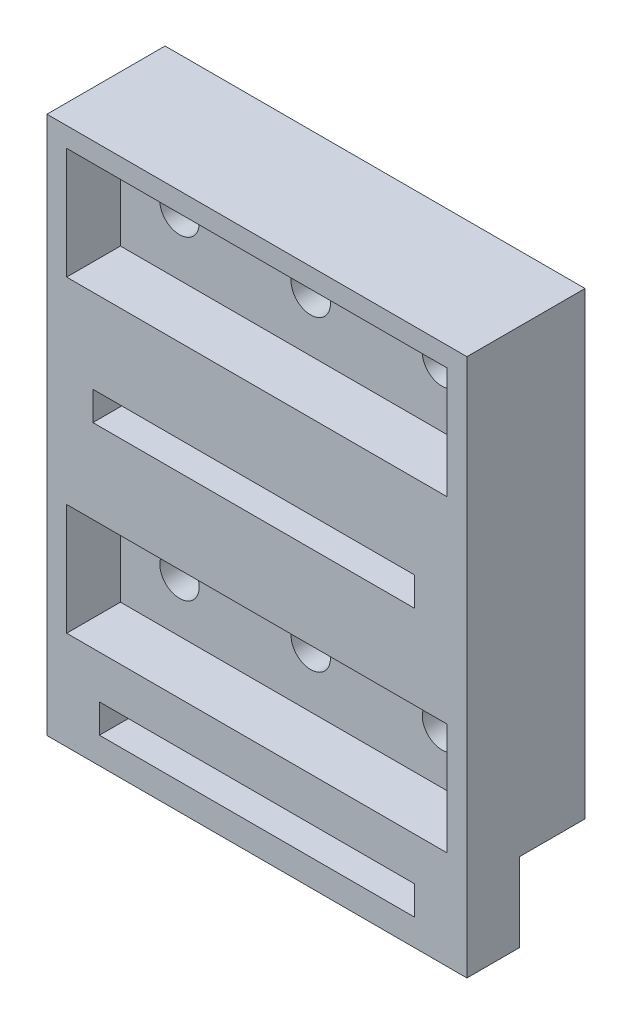
ISO-10303-21;
HEADER;
FILE_DESCRIPTION(('STEP AP214'),'2;1');
FILE_NAME('part.step','',(''),(''),'','','');
FILE_SCHEMA(('AUTOMOTIVE_DESIGN { 1 0 10303 214 1 1 1 1 }'));
ENDSEC;
DATA;
#1=APPLICATION_CONTEXT('core data for automotive mechanical design processes');
#2=APPLICATION_PROTOCOL_DEFINITION('international standard','automotive_design',2000,#1);
#3=PRODUCT_CONTEXT('',#1,'mechanical');
#4=PRODUCT('Part','Part','',(#3));
#5=PRODUCT_RELATED_PRODUCT_CATEGORY('part','',(#4));
#6=PRODUCT_DEFINITION_FORMATION('','',#4);
#7=PRODUCT_DEFINITION_CONTEXT('part definition',#1,'design');
#8=PRODUCT_DEFINITION('design','',#6,#7);
#9=PRODUCT_DEFINITION_SHAPE('','',#8);
#10=(LENGTH_UNIT() NAMED_UNIT(*) SI_UNIT(.MILLI.,.METRE.));
#11=(NAMED_UNIT(*) PLANE_ANGLE_UNIT() SI_UNIT($,.RADIAN.));
#12=(NAMED_UNIT(*) SI_UNIT($,.STERADIAN.) SOLID_ANGLE_UNIT());
#13=UNCERTAINTY_MEASURE_WITH_UNIT(LENGTH_MEASURE(1.E-05),#10,'distance_accuracy_value','');
#14=(GEOMETRIC_REPRESENTATION_CONTEXT(3) GLOBAL_UNCERTAINTY_ASSIGNED_CONTEXT((#13)) GLOBAL_UNIT_ASSIGNED_CONTEXT((#10,
#11,#12)) REPRESENTATION_CONTEXT('',''));
#15=CARTESIAN_POINT('',(0.,0.,0.));
#16=DIRECTION('',(0.,0.,1.));
#17=DIRECTION('',(1.,0.,0.));
#18=AXIS2_PLACEMENT_3D('',#15,#16,#17);
#19=CARTESIAN_POINT('',(-16.,-17.5,9.));
#20=DIRECTION('',(0.,1.,0.));
#21=DIRECTION('',(0.,0.,1.));
#22=AXIS2_PLACEMENT_3D('',#19,#20,#21);
#23=PLANE('',#22);
#24=DIRECTION('',(1.,0.,0.));
#25=VECTOR('',#24,1.);
#26=CARTESIAN_POINT('',(16.,-17.5,5.));
#27=LINE('',#26,#25);
#28=CARTESIAN_POINT('',(-16.,-17.5,5.));
#29=VERTEX_POINT('',#28);
#30=CARTESIAN_POINT('',(16.,-17.5,5.));
#31=VERTEX_POINT('',#30);
#32=EDGE_CURVE('E237',#29,#31,#27,.T.);
#33=ORIENTED_EDGE('',*,*,#32,.F.);
#34=DIRECTION('',(0.,0.,-1.));
#35=VECTOR('',#34,1.);
#36=CARTESIAN_POINT('',(-16.,-17.5,9.));
#37=LINE('',#36,#35);
#38=CARTESIAN_POINT('',(-16.,-17.5,0.));
#39=VERTEX_POINT('',#38);
#40=EDGE_CURVE('E420',#29,#39,#37,.T.);
#41=ORIENTED_EDGE('',*,*,#40,.T.);
#42=DIRECTION('',(1.,0.,0.));
#43=VECTOR('',#42,1.);
#44=CARTESIAN_POINT('',(-16.,-17.5,0.));
#45=LINE('',#44,#43);
#46=CARTESIAN_POINT('',(16.,-17.5,0.));
#47=VERTEX_POINT('',#46);
#48=EDGE_CURVE('E407',#39,#47,#45,.T.);
#49=ORIENTED_EDGE('',*,*,#48,.T.);
#50=DIRECTION('',(0.,0.,-1.));
#51=VECTOR('',#50,1.);
#52=CARTESIAN_POINT('',(16.,-17.5,9.));
#53=LINE('',#52,#51);
#54=EDGE_CURVE('E418',#31,#47,#53,.T.);
#55=ORIENTED_EDGE('',*,*,#54,.F.);
#56=EDGE_LOOP('',(#33,#41,#49,#55));
#57=FACE_BOUND('',#56,.T.);
#58=ADVANCED_FACE('F38',(#57),#23,.F.);
#59=CARTESIAN_POINT('',(-14.5,17.5,9.));
#60=DIRECTION('',(1.,0.,0.));
#61=DIRECTION('',(0.,1.,0.));
#62=AXIS2_PLACEMENT_3D('',#59,#60,#61);
#63=PLANE('',#62);
#64=DIRECTION('',(0.,-1.,0.));
#65=VECTOR('',#64,1.);
#66=CARTESIAN_POINT('',(-14.5,17.5,9.));
#67=LINE('',#66,#65);
#68=CARTESIAN_POINT('',(-14.5,16.,9.));
#69=VERTEX_POINT('',#68);
#70=CARTESIAN_POINT('',(-14.5,7.5,9.));
#71=VERTEX_POINT('',#70);
#72=EDGE_CURVE('E389',#69,#71,#67,.T.);
#73=ORIENTED_EDGE('',*,*,#72,.T.);
#74=DIRECTION('',(0.,0.,1.));
#75=VECTOR('',#74,1.);
#76=CARTESIAN_POINT('',(-14.5,7.5,9.));
#77=LINE('',#76,#75);
#78=CARTESIAN_POINT('',(-14.5,7.5,4.9));
#79=VERTEX_POINT('',#78);
#80=EDGE_CURVE('E304',#71,#79,#77,.F.);
#81=ORIENTED_EDGE('',*,*,#80,.T.);
#82=DIRECTION('',(0.,-1.,0.));
#83=VECTOR('',#82,1.);
#84=CARTESIAN_POINT('',(-14.5,17.5,4.9));
#85=LINE('',#84,#83);
#86=CARTESIAN_POINT('',(-14.5,16.,4.9));
#87=VERTEX_POINT('',#86);
#88=EDGE_CURVE('E363',#87,#79,#85,.T.);
#89=ORIENTED_EDGE('',*,*,#88,.F.);
#90=DIRECTION('',(0.,0.,-1.));
#91=VECTOR('',#90,1.);
#92=CARTESIAN_POINT('',(-14.5,16.,9.));
#93=LINE('',#92,#91);
#94=EDGE_CURVE('E372',#69,#87,#93,.T.);
#95=ORIENTED_EDGE('',*,*,#94,.F.);
#96=EDGE_LOOP('',(#73,#81,#89,#95));
#97=FACE_BOUND('',#96,.T.);
#98=ADVANCED_FACE('F458',(#97),#63,.T.);
#99=CARTESIAN_POINT('',(14.5,17.5,9.));
#100=DIRECTION('',(-1.,0.,0.));
#101=DIRECTION('',(0.,-1.,0.));
#102=AXIS2_PLACEMENT_3D('',#99,#100,#101);
#103=PLANE('',#102);
#104=DIRECTION('',(0.,1.,0.));
#105=VECTOR('',#104,1.);
#106=CARTESIAN_POINT('',(14.5,17.5,4.9));
#107=LINE('',#106,#105);
#108=CARTESIAN_POINT('',(14.5,7.5,4.9));
#109=VERTEX_POINT('',#108);
#110=CARTESIAN_POINT('',(14.5,16.,4.9));
#111=VERTEX_POINT('',#110);
#112=EDGE_CURVE('E378',#109,#111,#107,.T.);
#113=ORIENTED_EDGE('',*,*,#112,.F.);
#114=DIRECTION('',(0.,0.,1.));
#115=VECTOR('',#114,1.);
#116=CARTESIAN_POINT('',(14.5,7.5,9.));
#117=LINE('',#116,#115);
#118=CARTESIAN_POINT('',(14.5,7.5,9.));
#119=VERTEX_POINT('',#118);
#120=EDGE_CURVE('E321',#119,#109,#117,.F.);
#121=ORIENTED_EDGE('',*,*,#120,.F.);
#122=DIRECTION('',(0.,1.,0.));
#123=VECTOR('',#122,1.);
#124=CARTESIAN_POINT('',(14.5,17.5,9.));
#125=LINE('',#124,#123);
#126=CARTESIAN_POINT('',(14.5,16.,9.));
#127=VERTEX_POINT('',#126);
#128=EDGE_CURVE('E393',#119,#127,#125,.T.);
#129=ORIENTED_EDGE('',*,*,#128,.T.);
#130=DIRECTION('',(0.,0.,-1.));
#131=VECTOR('',#130,1.);
#132=CARTESIAN_POINT('',(14.5,16.,9.));
#133=LINE('',#132,#131);
#134=EDGE_CURVE('E375',#127,#111,#133,.T.);
#135=ORIENTED_EDGE('',*,*,#134,.T.);
#136=EDGE_LOOP('',(#113,#121,#129,#135));
#137=FACE_BOUND('',#136,.T.);
#138=ADVANCED_FACE('F463',(#137),#103,.T.);
#139=CARTESIAN_POINT('',(0.,0.,4.9));
#140=DIRECTION('',(0.,0.,1.));
#141=DIRECTION('',(1.,0.,0.));
#142=AXIS2_PLACEMENT_3D('',#139,#140,#141);
#143=PLANE('',#142);
#144=CARTESIAN_POINT('',(10.,12.,4.9));
#145=DIRECTION('',(0.,0.,1.));
#146=DIRECTION('',(-1.,0.,0.));
#147=AXIS2_PLACEMENT_3D('',#144,#145,#146);
#148=CIRCLE('',#147,1.5);
#149=CARTESIAN_POINT('',(8.5,12.,4.9));
#150=VERTEX_POINT('',#149);
#151=EDGE_CURVE('E320',#150,#150,#148,.T.);
#152=ORIENTED_EDGE('',*,*,#151,.F.);
#153=EDGE_LOOP('',(#152));
#154=FACE_BOUND('',#153,.T.);
#155=CARTESIAN_POINT('',(0.,11.7,4.9));
#156=DIRECTION('',(0.,0.,1.));
#157=DIRECTION('',(1.,0.,0.));
#158=AXIS2_PLACEMENT_3D('',#155,#156,#157);
#159=CIRCLE('',#158,1.5);
#160=CARTESIAN_POINT('',(1.5,11.7,4.9));
#161=VERTEX_POINT('',#160);
#162=EDGE_CURVE('E333',#161,#161,#159,.T.);
#163=ORIENTED_EDGE('',*,*,#162,.F.);
#164=EDGE_LOOP('',(#163));
#165=FACE_BOUND('',#164,.T.);
#166=CARTESIAN_POINT('',(-10.,12.,4.9));
#167=DIRECTION('',(0.,0.,1.));
#168=DIRECTION('',(-1.,0.,0.));
#169=AXIS2_PLACEMENT_3D('',#166,#167,#168);
#170=CIRCLE('',#169,1.5);
#171=CARTESIAN_POINT('',(-11.5,12.,4.9));
#172=VERTEX_POINT('',#171);
#173=EDGE_CURVE('E329',#172,#172,#170,.T.);
#174=ORIENTED_EDGE('',*,*,#173,.F.);
#175=EDGE_LOOP('',(#174));
#176=FACE_BOUND('',#175,.T.);
#177=ORIENTED_EDGE('',*,*,#88,.T.);
#178=DIRECTION('',(1.,0.,0.));
#179=VECTOR('',#178,1.);
#180=CARTESIAN_POINT('',(0.,7.5,4.9));
#181=LINE('',#180,#179);
#182=EDGE_CURVE('E422',#79,#109,#181,.T.);
#183=ORIENTED_EDGE('',*,*,#182,.T.);
#184=ORIENTED_EDGE('',*,*,#112,.T.);
#185=DIRECTION('',(-1.,0.,0.));
#186=VECTOR('',#185,1.);
#187=CARTESIAN_POINT('',(-16.,16.,4.9));
#188=LINE('',#187,#186);
#189=EDGE_CURVE('E384',#111,#87,#188,.T.);
#190=ORIENTED_EDGE('',*,*,#189,.T.);
#191=EDGE_LOOP('',(#177,#183,#184,#190));
#192=FACE_BOUND('',#191,.T.);
#193=ADVANCED_FACE('F488',(#154,#165,#176,#192),#143,.T.);
#194=CARTESIAN_POINT('',(-16.,17.5,9.));
#195=DIRECTION('',(1.,0.,0.));
#196=DIRECTION('',(0.,1.,0.));
#197=AXIS2_PLACEMENT_3D('',#194,#195,#196);
#198=PLANE('',#197);
#199=ORIENTED_EDGE('',*,*,#40,.F.);
#200=DIRECTION('',(0.,1.,0.));
#201=VECTOR('',#200,1.);
#202=CARTESIAN_POINT('',(-16.,-23.5,4.99999999999999));
#203=LINE('',#202,#201);
#204=CARTESIAN_POINT('',(-16.,-23.5,4.99999999999999));
#205=VERTEX_POINT('',#204);
#206=EDGE_CURVE('E255',#205,#29,#203,.T.);
#207=ORIENTED_EDGE('',*,*,#206,.F.);
#208=DIRECTION('',(0.,0.,-1.));
#209=VECTOR('',#208,1.);
#210=CARTESIAN_POINT('',(-16.,-23.5,9.));
#211=LINE('',#210,#209);
#212=CARTESIAN_POINT('',(-16.,-23.5,9.));
#213=VERTEX_POINT('',#212);
#214=EDGE_CURVE('E246',#213,#205,#211,.T.);
#215=ORIENTED_EDGE('',*,*,#214,.F.);
#216=DIRECTION('',(0.,-1.,0.));
#217=VECTOR('',#216,1.);
#218=CARTESIAN_POINT('',(-16.,17.5,9.));
#219=LINE('',#218,#217);
#220=CARTESIAN_POINT('',(-16.,17.5,9.));
#221=VERTEX_POINT('',#220);
#222=EDGE_CURVE('E397',#221,#213,#219,.T.);
#223=ORIENTED_EDGE('',*,*,#222,.F.);
#224=DIRECTION('',(0.,0.,-1.));
#225=VECTOR('',#224,1.);
#226=CARTESIAN_POINT('',(-16.,17.5,9.));
#227=LINE('',#226,#225);
#228=CARTESIAN_POINT('',(-16.,17.5,0.));
#229=VERTEX_POINT('',#228);
#230=EDGE_CURVE('E404',#221,#229,#227,.T.);
#231=ORIENTED_EDGE('',*,*,#230,.T.);
#232=DIRECTION('',(0.,-1.,0.));
#233=VECTOR('',#232,1.);
#234=CARTESIAN_POINT('',(-16.,17.5,0.));
#235=LINE('',#234,#233);
#236=EDGE_CURVE('E370',#229,#39,#235,.T.);
#237=ORIENTED_EDGE('',*,*,#236,.T.);
#238=EDGE_LOOP('',(#199,#207,#215,#223,#231,#237));
#239=FACE_BOUND('',#238,.T.);
#240=ADVANCED_FACE('F40',(#239),#198,.F.);
#241=CARTESIAN_POINT('',(16.,17.5,9.));
#242=DIRECTION('',(-1.,0.,0.));
#243=DIRECTION('',(0.,-1.,0.));
#244=AXIS2_PLACEMENT_3D('',#241,#242,#243);
#245=PLANE('',#244);
#246=DIRECTION('',(0.,0.,-1.));
#247=VECTOR('',#246,1.);
#248=CARTESIAN_POINT('',(16.,17.5,9.));
#249=LINE('',#248,#247);
#250=CARTESIAN_POINT('',(16.,17.5,9.));
#251=VERTEX_POINT('',#250);
#252=CARTESIAN_POINT('',(16.,17.5,0.));
#253=VERTEX_POINT('',#252);
#254=EDGE_CURVE('E415',#251,#253,#249,.T.);
#255=ORIENTED_EDGE('',*,*,#254,.F.);
#256=DIRECTION('',(0.,1.,0.));
#257=VECTOR('',#256,1.);
#258=CARTESIAN_POINT('',(16.,17.5,9.));
#259=LINE('',#258,#257);
#260=CARTESIAN_POINT('',(16.,-23.5,9.));
#261=VERTEX_POINT('',#260);
#262=EDGE_CURVE('E399',#261,#251,#259,.T.);
#263=ORIENTED_EDGE('',*,*,#262,.F.);
#264=DIRECTION('',(0.,0.,1.));
#265=VECTOR('',#264,1.);
#266=CARTESIAN_POINT('',(16.,-23.5,9.));
#267=LINE('',#266,#265);
#268=CARTESIAN_POINT('',(16.,-23.5,5.));
#269=VERTEX_POINT('',#268);
#270=EDGE_CURVE('E240',#269,#261,#267,.T.);
#271=ORIENTED_EDGE('',*,*,#270,.F.);
#272=DIRECTION('',(0.,1.,0.));
#273=VECTOR('',#272,1.);
#274=CARTESIAN_POINT('',(16.,-23.5,5.));
#275=LINE('',#274,#273);
#276=EDGE_CURVE('E250',#269,#31,#275,.T.);
#277=ORIENTED_EDGE('',*,*,#276,.T.);
#278=ORIENTED_EDGE('',*,*,#54,.T.);
#279=DIRECTION('',(0.,1.,0.));
#280=VECTOR('',#279,1.);
#281=CARTESIAN_POINT('',(16.,17.5,0.));
#282=LINE('',#281,#280);
#283=EDGE_CURVE('E410',#47,#253,#282,.T.);
#284=ORIENTED_EDGE('',*,*,#283,.T.);
#285=EDGE_LOOP('',(#255,#263,#271,#277,#278,#284));
#286=FACE_BOUND('',#285,.T.);
#287=ADVANCED_FACE('F468',(#286),#245,.F.);
#288=CARTESIAN_POINT('',(-16.,17.5,9.));
#289=DIRECTION('',(0.,-1.,0.));
#290=DIRECTION('',(0.,0.,-1.));
#291=AXIS2_PLACEMENT_3D('',#288,#289,#290);
#292=PLANE('',#291);
#293=DIRECTION('',(-1.,0.,0.));
#294=VECTOR('',#293,1.);
#295=CARTESIAN_POINT('',(-16.,17.5,0.));
#296=LINE('',#295,#294);
#297=EDGE_CURVE('E400',#253,#229,#296,.T.);
#298=ORIENTED_EDGE('',*,*,#297,.T.);
#299=ORIENTED_EDGE('',*,*,#230,.F.);
#300=DIRECTION('',(-1.,0.,0.));
#301=VECTOR('',#300,1.);
#302=CARTESIAN_POINT('',(-16.,17.5,9.));
#303=LINE('',#302,#301);
#304=EDGE_CURVE('E402',#251,#221,#303,.T.);
#305=ORIENTED_EDGE('',*,*,#304,.F.);
#306=ORIENTED_EDGE('',*,*,#254,.T.);
#307=EDGE_LOOP('',(#298,#299,#305,#306));
#308=FACE_BOUND('',#307,.T.);
#309=ADVANCED_FACE('F471',(#308),#292,.F.);
#310=CARTESIAN_POINT('',(0.,0.,9.));
#311=DIRECTION('',(0.,0.,1.));
#312=DIRECTION('',(1.,0.,0.));
#313=AXIS2_PLACEMENT_3D('',#310,#311,#312);
#314=PLANE('',#313);
#315=DIRECTION('',(0.,1.,0.));
#316=VECTOR('',#315,1.);
#317=CARTESIAN_POINT('',(12.,-21.48,9.));
#318=LINE('',#317,#316);
#319=CARTESIAN_POINT('',(12.,-21.48,9.));
#320=VERTEX_POINT('',#319);
#321=CARTESIAN_POINT('',(12.,-19.28,9.));
#322=VERTEX_POINT('',#321);
#323=EDGE_CURVE('E53',#320,#322,#318,.T.);
#324=ORIENTED_EDGE('',*,*,#323,.F.);
#325=DIRECTION('',(1.,0.,0.));
#326=VECTOR('',#325,1.);
#327=CARTESIAN_POINT('',(12.,-21.48,9.));
#328=LINE('',#327,#326);
#329=CARTESIAN_POINT('',(-12.,-21.48,9.));
#330=VERTEX_POINT('',#329);
#331=EDGE_CURVE('E230',#330,#320,#328,.T.);
#332=ORIENTED_EDGE('',*,*,#331,.F.);
#333=DIRECTION('',(0.,-1.,0.));
#334=VECTOR('',#333,1.);
#335=CARTESIAN_POINT('',(-12.,-21.48,9.));
#336=LINE('',#335,#334);
#337=CARTESIAN_POINT('',(-12.,-19.28,9.));
#338=VERTEX_POINT('',#337);
#339=EDGE_CURVE('E214',#338,#330,#336,.T.);
#340=ORIENTED_EDGE('',*,*,#339,.F.);
#341=DIRECTION('',(-1.,0.,0.));
#342=VECTOR('',#341,1.);
#343=CARTESIAN_POINT('',(12.,-19.28,9.));
#344=LINE('',#343,#342);
#345=EDGE_CURVE('E223',#322,#338,#344,.T.);
#346=ORIENTED_EDGE('',*,*,#345,.F.);
#347=EDGE_LOOP('',(#324,#332,#340,#346));
#348=FACE_BOUND('',#347,.T.);
#349=DIRECTION('',(0.,-1.,0.));
#350=VECTOR('',#349,1.);
#351=CARTESIAN_POINT('',(-12.5,0.,9.));
#352=LINE('',#351,#350);
#353=CARTESIAN_POINT('',(-12.5,1.1,9.));
#354=VERTEX_POINT('',#353);
#355=CARTESIAN_POINT('',(-12.5,-1.1,9.));
#356=VERTEX_POINT('',#355);
#357=EDGE_CURVE('E434',#354,#356,#352,.T.);
#358=ORIENTED_EDGE('',*,*,#357,.F.);
#359=DIRECTION('',(-1.,0.,0.));
#360=VECTOR('',#359,1.);
#361=CARTESIAN_POINT('',(0.,1.1,9.));
#362=LINE('',#361,#360);
#363=CARTESIAN_POINT('',(12.,1.1,9.));
#364=VERTEX_POINT('',#363);
#365=EDGE_CURVE('E426',#364,#354,#362,.T.);
#366=ORIENTED_EDGE('',*,*,#365,.F.);
#367=DIRECTION('',(0.,1.,0.));
#368=VECTOR('',#367,1.);
#369=CARTESIAN_POINT('',(12.,0.,9.));
#370=LINE('',#369,#368);
#371=CARTESIAN_POINT('',(12.,-1.1,9.));
#372=VERTEX_POINT('',#371);
#373=EDGE_CURVE('E429',#372,#364,#370,.T.);
#374=ORIENTED_EDGE('',*,*,#373,.F.);
#375=DIRECTION('',(1.,0.,0.));
#376=VECTOR('',#375,1.);
#377=CARTESIAN_POINT('',(0.,-1.1,9.));
#378=LINE('',#377,#376);
#379=EDGE_CURVE('E432',#356,#372,#378,.T.);
#380=ORIENTED_EDGE('',*,*,#379,.F.);
#381=EDGE_LOOP('',(#358,#366,#374,#380));
#382=FACE_BOUND('',#381,.T.);
#383=CARTESIAN_POINT('',(-14.5,-7.5,9.));
#384=VERTEX_POINT('',#383);
#385=CARTESIAN_POINT('',(-14.5,-16.,9.));
#386=VERTEX_POINT('',#385);
#387=EDGE_CURVE('E388',#384,#386,#67,.T.);
#388=ORIENTED_EDGE('',*,*,#387,.F.);
#389=DIRECTION('',(1.,0.,0.));
#390=VECTOR('',#389,1.);
#391=CARTESIAN_POINT('',(14.5,-7.5,9.));
#392=LINE('',#391,#390);
#393=CARTESIAN_POINT('',(14.5,-7.5,9.));
#394=VERTEX_POINT('',#393);
#395=EDGE_CURVE('E313',#394,#384,#392,.F.);
#396=ORIENTED_EDGE('',*,*,#395,.F.);
#397=CARTESIAN_POINT('',(14.5,-16.,9.));
#398=VERTEX_POINT('',#397);
#399=EDGE_CURVE('E394',#398,#394,#125,.T.);
#400=ORIENTED_EDGE('',*,*,#399,.F.);
#401=DIRECTION('',(1.,0.,0.));
#402=VECTOR('',#401,1.);
#403=CARTESIAN_POINT('',(-16.,-16.,9.));
#404=LINE('',#403,#402);
#405=EDGE_CURVE('E391',#386,#398,#404,.T.);
#406=ORIENTED_EDGE('',*,*,#405,.F.);
#407=EDGE_LOOP('',(#388,#396,#400,#406));
#408=FACE_BOUND('',#407,.T.);
#409=DIRECTION('',(1.,0.,0.));
#410=VECTOR('',#409,1.);
#411=CARTESIAN_POINT('',(14.5,7.5,9.));
#412=LINE('',#411,#410);
#413=EDGE_CURVE('E317',#119,#71,#412,.F.);
#414=ORIENTED_EDGE('',*,*,#413,.T.);
#415=ORIENTED_EDGE('',*,*,#72,.F.);
#416=DIRECTION('',(-1.,0.,0.));
#417=VECTOR('',#416,1.);
#418=CARTESIAN_POINT('',(-16.,16.,9.));
#419=LINE('',#418,#417);
#420=EDGE_CURVE('E376',#127,#69,#419,.T.);
#421=ORIENTED_EDGE('',*,*,#420,.F.);
#422=ORIENTED_EDGE('',*,*,#128,.F.);
#423=EDGE_LOOP('',(#414,#415,#421,#422));
#424=FACE_BOUND('',#423,.T.);
#425=ORIENTED_EDGE('',*,*,#262,.T.);
#426=ORIENTED_EDGE('',*,*,#304,.T.);
#427=ORIENTED_EDGE('',*,*,#222,.T.);
#428=DIRECTION('',(-1.,0.,0.));
#429=VECTOR('',#428,1.);
#430=CARTESIAN_POINT('',(16.,-23.5,9.));
#431=LINE('',#430,#429);
#432=EDGE_CURVE('E243',#261,#213,#431,.T.);
#433=ORIENTED_EDGE('',*,*,#432,.F.);
#434=EDGE_LOOP('',(#425,#426,#427,#433));
#435=FACE_BOUND('',#434,.T.);
#436=ADVANCED_FACE('F227',(#348,#382,#408,#424,#435),#314,.T.);
#437=CARTESIAN_POINT('',(0.,0.,0.));
#438=DIRECTION('',(0.,0.,1.));
#439=DIRECTION('',(1.,0.,0.));
#440=AXIS2_PLACEMENT_3D('',#437,#438,#439);
#441=PLANE('',#440);
#442=DIRECTION('',(1.,0.,0.));
#443=VECTOR('',#442,1.);
#444=CARTESIAN_POINT('',(-14.,5.,0.));
#445=LINE('',#444,#443);
#446=CARTESIAN_POINT('',(-14.,5.,0.));
#447=VERTEX_POINT('',#446);
#448=CARTESIAN_POINT('',(14.,5.,0.));
#449=VERTEX_POINT('',#448);
#450=EDGE_CURVE('E294',#447,#449,#445,.T.);
#451=ORIENTED_EDGE('',*,*,#450,.F.);
#452=DIRECTION('',(0.,1.,0.));
#453=VECTOR('',#452,1.);
#454=CARTESIAN_POINT('',(-14.,-5.,0.));
#455=LINE('',#454,#453);
#456=CARTESIAN_POINT('',(-14.,-5.,0.));
#457=VERTEX_POINT('',#456);
#458=EDGE_CURVE('E272',#457,#447,#455,.T.);
#459=ORIENTED_EDGE('',*,*,#458,.F.);
#460=DIRECTION('',(-1.,0.,0.));
#461=VECTOR('',#460,1.);
#462=CARTESIAN_POINT('',(-14.,-5.,0.));
#463=LINE('',#462,#461);
#464=CARTESIAN_POINT('',(14.,-5.,0.));
#465=VERTEX_POINT('',#464);
#466=EDGE_CURVE('E283',#465,#457,#463,.T.);
#467=ORIENTED_EDGE('',*,*,#466,.F.);
#468=DIRECTION('',(0.,-1.,0.));
#469=VECTOR('',#468,1.);
#470=CARTESIAN_POINT('',(14.,-5.,0.));
#471=LINE('',#470,#469);
#472=EDGE_CURVE('E297',#449,#465,#471,.T.);
#473=ORIENTED_EDGE('',*,*,#472,.F.);
#474=EDGE_LOOP('',(#451,#459,#467,#473));
#475=FACE_BOUND('',#474,.T.);
#476=ORIENTED_EDGE('',*,*,#297,.F.);
#477=ORIENTED_EDGE('',*,*,#283,.F.);
#478=ORIENTED_EDGE('',*,*,#48,.F.);
#479=ORIENTED_EDGE('',*,*,#236,.F.);
#480=EDGE_LOOP('',(#476,#477,#478,#479));
#481=FACE_BOUND('',#480,.T.);
#482=CARTESIAN_POINT('',(-10.,12.,0.));
#483=DIRECTION('',(0.,0.,1.));
#484=DIRECTION('',(1.,0.,0.));
#485=AXIS2_PLACEMENT_3D('',#482,#483,#484);
#486=CIRCLE('',#485,1.5);
#487=CARTESIAN_POINT('',(-8.5,12.,0.));
#488=VERTEX_POINT('',#487);
#489=EDGE_CURVE('E359',#488,#488,#486,.T.);
#490=ORIENTED_EDGE('',*,*,#489,.T.);
#491=EDGE_LOOP('',(#490));
#492=FACE_BOUND('',#491,.T.);
#493=CARTESIAN_POINT('',(0.,11.7,0.));
#494=DIRECTION('',(0.,0.,1.));
#495=DIRECTION('',(1.,0.,0.));
#496=AXIS2_PLACEMENT_3D('',#493,#494,#495);
#497=CIRCLE('',#496,1.5);
#498=CARTESIAN_POINT('',(1.5,11.7,0.));
#499=VERTEX_POINT('',#498);
#500=EDGE_CURVE('E353',#499,#499,#497,.T.);
#501=ORIENTED_EDGE('',*,*,#500,.T.);
#502=EDGE_LOOP('',(#501));
#503=FACE_BOUND('',#502,.T.);
#504=CARTESIAN_POINT('',(10.,12.,0.));
#505=DIRECTION('',(0.,0.,1.));
#506=DIRECTION('',(1.,0.,0.));
#507=AXIS2_PLACEMENT_3D('',#504,#505,#506);
#508=CIRCLE('',#507,1.5);
#509=CARTESIAN_POINT('',(11.5,12.,0.));
#510=VERTEX_POINT('',#509);
#511=EDGE_CURVE('E347',#510,#510,#508,.T.);
#512=ORIENTED_EDGE('',*,*,#511,.T.);
#513=EDGE_LOOP('',(#512));
#514=FACE_BOUND('',#513,.T.);
#515=CARTESIAN_POINT('',(0.,-11.7,0.));
#516=DIRECTION('',(0.,0.,1.));
#517=DIRECTION('',(1.,0.,0.));
#518=AXIS2_PLACEMENT_3D('',#515,#516,#517);
#519=CIRCLE('',#518,1.5);
#520=CARTESIAN_POINT('',(1.5,-11.7,0.));
#521=VERTEX_POINT('',#520);
#522=EDGE_CURVE('E356',#521,#521,#519,.T.);
#523=ORIENTED_EDGE('',*,*,#522,.T.);
#524=EDGE_LOOP('',(#523));
#525=FACE_BOUND('',#524,.T.);
#526=CARTESIAN_POINT('',(10.,-12.,0.));
#527=DIRECTION('',(0.,0.,1.));
#528=DIRECTION('',(1.,0.,0.));
#529=AXIS2_PLACEMENT_3D('',#526,#527,#528);
#530=CIRCLE('',#529,1.5);
#531=CARTESIAN_POINT('',(11.5,-12.,0.));
#532=VERTEX_POINT('',#531);
#533=EDGE_CURVE('E350',#532,#532,#530,.T.);
#534=ORIENTED_EDGE('',*,*,#533,.T.);
#535=EDGE_LOOP('',(#534));
#536=FACE_BOUND('',#535,.T.);
#537=CARTESIAN_POINT('',(-10.,-12.,0.));
#538=DIRECTION('',(0.,0.,1.));
#539=DIRECTION('',(1.,0.,0.));
#540=AXIS2_PLACEMENT_3D('',#537,#538,#539);
#541=CIRCLE('',#540,1.5);
#542=CARTESIAN_POINT('',(-8.5,-12.,0.));
#543=VERTEX_POINT('',#542);
#544=EDGE_CURVE('E344',#543,#543,#541,.T.);
#545=ORIENTED_EDGE('',*,*,#544,.T.);
#546=EDGE_LOOP('',(#545));
#547=FACE_BOUND('',#546,.T.);
#548=ADVANCED_FACE('F476',(#475,#481,#492,#503,#514,#525,#536,#547),#441,.F.);
#549=DIRECTION('',(0.,0.,1.));
#550=VECTOR('',#549,1.);
#551=CARTESIAN_POINT('',(-14.5,-7.5,9.));
#552=LINE('',#551,#550);
#553=CARTESIAN_POINT('',(-14.5,-7.5,4.9));
#554=VERTEX_POINT('',#553);
#555=EDGE_CURVE('E314',#384,#554,#552,.F.);
#556=ORIENTED_EDGE('',*,*,#555,.F.);
#557=ORIENTED_EDGE('',*,*,#387,.T.);
#558=DIRECTION('',(0.,0.,-1.));
#559=VECTOR('',#558,1.);
#560=CARTESIAN_POINT('',(-14.5,-16.,9.));
#561=LINE('',#560,#559);
#562=CARTESIAN_POINT('',(-14.5,-16.,4.9));
#563=VERTEX_POINT('',#562);
#564=EDGE_CURVE('E367',#386,#563,#561,.T.);
#565=ORIENTED_EDGE('',*,*,#564,.T.);
#566=EDGE_CURVE('E362',#554,#563,#85,.T.);
#567=ORIENTED_EDGE('',*,*,#566,.F.);
#568=EDGE_LOOP('',(#556,#557,#565,#567));
#569=FACE_BOUND('',#568,.T.);
#570=ADVANCED_FACE('F466',(#569),#63,.T.);
#571=CARTESIAN_POINT('',(-16.,-16.,9.));
#572=DIRECTION('',(0.,1.,0.));
#573=DIRECTION('',(0.,0.,1.));
#574=AXIS2_PLACEMENT_3D('',#571,#572,#573);
#575=PLANE('',#574);
#576=DIRECTION('',(1.,0.,0.));
#577=VECTOR('',#576,1.);
#578=CARTESIAN_POINT('',(-16.,-16.,4.9));
#579=LINE('',#578,#577);
#580=CARTESIAN_POINT('',(14.5,-16.,4.9));
#581=VERTEX_POINT('',#580);
#582=EDGE_CURVE('E366',#563,#581,#579,.T.);
#583=ORIENTED_EDGE('',*,*,#582,.F.);
#584=ORIENTED_EDGE('',*,*,#564,.F.);
#585=ORIENTED_EDGE('',*,*,#405,.T.);
#586=DIRECTION('',(0.,0.,-1.));
#587=VECTOR('',#586,1.);
#588=CARTESIAN_POINT('',(14.5,-16.,9.));
#589=LINE('',#588,#587);
#590=EDGE_CURVE('E371',#398,#581,#589,.T.);
#591=ORIENTED_EDGE('',*,*,#590,.T.);
#592=EDGE_LOOP('',(#583,#584,#585,#591));
#593=FACE_BOUND('',#592,.T.);
#594=ADVANCED_FACE('F495',(#593),#575,.T.);
#595=DIRECTION('',(0.,0.,1.));
#596=VECTOR('',#595,1.);
#597=CARTESIAN_POINT('',(14.5,-7.5,9.));
#598=LINE('',#597,#596);
#599=CARTESIAN_POINT('',(14.5,-7.5,4.9));
#600=VERTEX_POINT('',#599);
#601=EDGE_CURVE('E311',#394,#600,#598,.F.);
#602=ORIENTED_EDGE('',*,*,#601,.T.);
#603=EDGE_CURVE('E381',#581,#600,#107,.T.);
#604=ORIENTED_EDGE('',*,*,#603,.F.);
#605=ORIENTED_EDGE('',*,*,#590,.F.);
#606=ORIENTED_EDGE('',*,*,#399,.T.);
#607=EDGE_LOOP('',(#602,#604,#605,#606));
#608=FACE_BOUND('',#607,.T.);
#609=ADVANCED_FACE('F491',(#608),#103,.T.);
#610=CARTESIAN_POINT('',(-16.,16.,9.));
#611=DIRECTION('',(0.,-1.,0.));
#612=DIRECTION('',(0.,0.,-1.));
#613=AXIS2_PLACEMENT_3D('',#610,#611,#612);
#614=PLANE('',#613);
#615=ORIENTED_EDGE('',*,*,#189,.F.);
#616=ORIENTED_EDGE('',*,*,#134,.F.);
#617=ORIENTED_EDGE('',*,*,#420,.T.);
#618=ORIENTED_EDGE('',*,*,#94,.T.);
#619=EDGE_LOOP('',(#615,#616,#617,#618));
#620=FACE_BOUND('',#619,.T.);
#621=ADVANCED_FACE('F486',(#620),#614,.T.);
#622=DIRECTION('',(1.,0.,0.));
#623=VECTOR('',#622,1.);
#624=CARTESIAN_POINT('',(0.,-7.5,4.9));
#625=LINE('',#624,#623);
#626=EDGE_CURVE('E423',#554,#600,#625,.T.);
#627=ORIENTED_EDGE('',*,*,#626,.F.);
#628=ORIENTED_EDGE('',*,*,#566,.T.);
#629=ORIENTED_EDGE('',*,*,#582,.T.);
#630=ORIENTED_EDGE('',*,*,#603,.T.);
#631=EDGE_LOOP('',(#627,#628,#629,#630));
#632=FACE_BOUND('',#631,.T.);
#633=CARTESIAN_POINT('',(0.,-11.7,4.9));
#634=DIRECTION('',(0.,0.,1.));
#635=DIRECTION('',(-1.,0.,0.));
#636=AXIS2_PLACEMENT_3D('',#633,#634,#635);
#637=CIRCLE('',#636,1.5);
#638=CARTESIAN_POINT('',(-1.5,-11.7,4.9));
#639=VERTEX_POINT('',#638);
#640=EDGE_CURVE('E330',#639,#639,#637,.T.);
#641=ORIENTED_EDGE('',*,*,#640,.F.);
#642=EDGE_LOOP('',(#641));
#643=FACE_BOUND('',#642,.T.);
#644=CARTESIAN_POINT('',(10.,-12.,4.9));
#645=DIRECTION('',(0.,0.,1.));
#646=DIRECTION('',(1.,0.,0.));
#647=AXIS2_PLACEMENT_3D('',#644,#645,#646);
#648=CIRCLE('',#647,1.5);
#649=CARTESIAN_POINT('',(11.5,-12.,4.9));
#650=VERTEX_POINT('',#649);
#651=EDGE_CURVE('E336',#650,#650,#648,.T.);
#652=ORIENTED_EDGE('',*,*,#651,.F.);
#653=EDGE_LOOP('',(#652));
#654=FACE_BOUND('',#653,.T.);
#655=CARTESIAN_POINT('',(-10.,-12.,4.9));
#656=DIRECTION('',(0.,0.,1.));
#657=DIRECTION('',(1.,0.,0.));
#658=AXIS2_PLACEMENT_3D('',#655,#656,#657);
#659=CIRCLE('',#658,1.5);
#660=CARTESIAN_POINT('',(-8.5,-12.,4.9));
#661=VERTEX_POINT('',#660);
#662=EDGE_CURVE('E339',#661,#661,#659,.T.);
#663=ORIENTED_EDGE('',*,*,#662,.F.);
#664=EDGE_LOOP('',(#663));
#665=FACE_BOUND('',#664,.T.);
#666=ADVANCED_FACE('F482',(#632,#643,#654,#665),#143,.T.);
#667=CARTESIAN_POINT('',(-10.,-12.,-4.1));
#668=DIRECTION('',(0.,0.,1.));
#669=DIRECTION('',(1.,0.,0.));
#670=AXIS2_PLACEMENT_3D('',#667,#668,#669);
#671=CYLINDRICAL_SURFACE('',#670,1.5);
#672=ORIENTED_EDGE('',*,*,#662,.T.);
#673=EDGE_LOOP('',(#672));
#674=FACE_BOUND('',#673,.T.);
#675=ORIENTED_EDGE('',*,*,#544,.F.);
#676=EDGE_LOOP('',(#675));
#677=FACE_BOUND('',#676,.T.);
#678=ADVANCED_FACE('F485',(#674,#677),#671,.F.);
#679=CARTESIAN_POINT('',(10.,12.,-4.1));
#680=DIRECTION('',(0.,0.,1.));
#681=DIRECTION('',(1.,0.,0.));
#682=AXIS2_PLACEMENT_3D('',#679,#680,#681);
#683=CYLINDRICAL_SURFACE('',#682,1.5);
#684=ORIENTED_EDGE('',*,*,#151,.T.);
#685=EDGE_LOOP('',(#684));
#686=FACE_BOUND('',#685,.T.);
#687=ORIENTED_EDGE('',*,*,#511,.F.);
#688=EDGE_LOOP('',(#687));
#689=FACE_BOUND('',#688,.T.);
#690=ADVANCED_FACE('F504',(#686,#689),#683,.F.);
#691=CARTESIAN_POINT('',(10.,-12.,-4.1));
#692=DIRECTION('',(0.,0.,1.));
#693=DIRECTION('',(1.,0.,0.));
#694=AXIS2_PLACEMENT_3D('',#691,#692,#693);
#695=CYLINDRICAL_SURFACE('',#694,1.5);
#696=ORIENTED_EDGE('',*,*,#651,.T.);
#697=EDGE_LOOP('',(#696));
#698=FACE_BOUND('',#697,.T.);
#699=ORIENTED_EDGE('',*,*,#533,.F.);
#700=EDGE_LOOP('',(#699));
#701=FACE_BOUND('',#700,.T.);
#702=ADVANCED_FACE('F510',(#698,#701),#695,.F.);
#703=CARTESIAN_POINT('',(0.,11.7,-4.1));
#704=DIRECTION('',(0.,0.,1.));
#705=DIRECTION('',(1.,0.,0.));
#706=AXIS2_PLACEMENT_3D('',#703,#704,#705);
#707=CYLINDRICAL_SURFACE('',#706,1.5);
#708=ORIENTED_EDGE('',*,*,#162,.T.);
#709=EDGE_LOOP('',(#708));
#710=FACE_BOUND('',#709,.T.);
#711=ORIENTED_EDGE('',*,*,#500,.F.);
#712=EDGE_LOOP('',(#711));
#713=FACE_BOUND('',#712,.T.);
#714=ADVANCED_FACE('F506',(#710,#713),#707,.F.);
#715=CARTESIAN_POINT('',(0.,-11.7,-4.1));
#716=DIRECTION('',(0.,0.,1.));
#717=DIRECTION('',(1.,0.,0.));
#718=AXIS2_PLACEMENT_3D('',#715,#716,#717);
#719=CYLINDRICAL_SURFACE('',#718,1.5);
#720=ORIENTED_EDGE('',*,*,#640,.T.);
#721=EDGE_LOOP('',(#720));
#722=FACE_BOUND('',#721,.T.);
#723=ORIENTED_EDGE('',*,*,#522,.F.);
#724=EDGE_LOOP('',(#723));
#725=FACE_BOUND('',#724,.T.);
#726=ADVANCED_FACE('F509',(#722,#725),#719,.F.);
#727=CARTESIAN_POINT('',(-10.,12.,-4.1));
#728=DIRECTION('',(0.,0.,1.));
#729=DIRECTION('',(1.,0.,0.));
#730=AXIS2_PLACEMENT_3D('',#727,#728,#729);
#731=CYLINDRICAL_SURFACE('',#730,1.5);
#732=ORIENTED_EDGE('',*,*,#173,.T.);
#733=EDGE_LOOP('',(#732));
#734=FACE_BOUND('',#733,.T.);
#735=ORIENTED_EDGE('',*,*,#489,.F.);
#736=EDGE_LOOP('',(#735));
#737=FACE_BOUND('',#736,.T.);
#738=ADVANCED_FACE('F515',(#734,#737),#731,.F.);
#739=CARTESIAN_POINT('',(14.5,-7.5,9.));
#740=DIRECTION('',(0.,-1.,0.));
#741=DIRECTION('',(1.,0.,0.));
#742=AXIS2_PLACEMENT_3D('',#739,#740,#741);
#743=PLANE('',#742);
#744=ORIENTED_EDGE('',*,*,#555,.T.);
#745=ORIENTED_EDGE('',*,*,#626,.T.);
#746=ORIENTED_EDGE('',*,*,#601,.F.);
#747=ORIENTED_EDGE('',*,*,#395,.T.);
#748=EDGE_LOOP('',(#744,#745,#746,#747));
#749=FACE_BOUND('',#748,.T.);
#750=ADVANCED_FACE('F518',(#749),#743,.T.);
#751=CARTESIAN_POINT('',(14.5,7.5,9.));
#752=DIRECTION('',(0.,-1.,0.));
#753=DIRECTION('',(1.,0.,0.));
#754=AXIS2_PLACEMENT_3D('',#751,#752,#753);
#755=PLANE('',#754);
#756=ORIENTED_EDGE('',*,*,#182,.F.);
#757=ORIENTED_EDGE('',*,*,#80,.F.);
#758=ORIENTED_EDGE('',*,*,#413,.F.);
#759=ORIENTED_EDGE('',*,*,#120,.T.);
#760=EDGE_LOOP('',(#756,#757,#758,#759));
#761=FACE_BOUND('',#760,.T.);
#762=ADVANCED_FACE('F526',(#761),#755,.F.);
#763=CARTESIAN_POINT('',(-14.,-5.,5.));
#764=DIRECTION('',(-1.,0.,0.));
#765=DIRECTION('',(0.,-1.,0.));
#766=AXIS2_PLACEMENT_3D('',#763,#764,#765);
#767=PLANE('',#766);
#768=ORIENTED_EDGE('',*,*,#458,.T.);
#769=DIRECTION('',(0.,0.,-1.));
#770=VECTOR('',#769,1.);
#771=CARTESIAN_POINT('',(-14.,5.,5.));
#772=LINE('',#771,#770);
#773=CARTESIAN_POINT('',(-14.,5.,5.));
#774=VERTEX_POINT('',#773);
#775=EDGE_CURVE('E292',#774,#447,#772,.T.);
#776=ORIENTED_EDGE('',*,*,#775,.F.);
#777=DIRECTION('',(0.,1.,0.));
#778=VECTOR('',#777,1.);
#779=CARTESIAN_POINT('',(-14.,-5.,5.));
#780=LINE('',#779,#778);
#781=CARTESIAN_POINT('',(-14.,-5.,5.));
#782=VERTEX_POINT('',#781);
#783=EDGE_CURVE('E279',#782,#774,#780,.T.);
#784=ORIENTED_EDGE('',*,*,#783,.F.);
#785=DIRECTION('',(0.,0.,-1.));
#786=VECTOR('',#785,1.);
#787=CARTESIAN_POINT('',(-14.,-5.,5.));
#788=LINE('',#787,#786);
#789=EDGE_CURVE('E302',#782,#457,#788,.T.);
#790=ORIENTED_EDGE('',*,*,#789,.T.);
#791=EDGE_LOOP('',(#768,#776,#784,#790));
#792=FACE_BOUND('',#791,.T.);
#793=ADVANCED_FACE('F529',(#792),#767,.F.);
#794=CARTESIAN_POINT('',(-14.,-5.,5.));
#795=DIRECTION('',(0.,-1.,0.));
#796=DIRECTION('',(1.,0.,0.));
#797=AXIS2_PLACEMENT_3D('',#794,#795,#796);
#798=PLANE('',#797);
#799=ORIENTED_EDGE('',*,*,#466,.T.);
#800=ORIENTED_EDGE('',*,*,#789,.F.);
#801=DIRECTION('',(-1.,0.,0.));
#802=VECTOR('',#801,1.);
#803=CARTESIAN_POINT('',(-14.,-5.,5.));
#804=LINE('',#803,#802);
#805=CARTESIAN_POINT('',(14.,-5.,5.));
#806=VERTEX_POINT('',#805);
#807=EDGE_CURVE('E289',#806,#782,#804,.T.);
#808=ORIENTED_EDGE('',*,*,#807,.F.);
#809=DIRECTION('',(0.,0.,-1.));
#810=VECTOR('',#809,1.);
#811=CARTESIAN_POINT('',(14.,-5.,5.));
#812=LINE('',#811,#810);
#813=EDGE_CURVE('E305',#806,#465,#812,.T.);
#814=ORIENTED_EDGE('',*,*,#813,.T.);
#815=EDGE_LOOP('',(#799,#800,#808,#814));
#816=FACE_BOUND('',#815,.T.);
#817=ADVANCED_FACE('F536',(#816),#798,.F.);
#818=CARTESIAN_POINT('',(14.,-5.,5.));
#819=DIRECTION('',(1.,0.,0.));
#820=DIRECTION('',(0.,1.,0.));
#821=AXIS2_PLACEMENT_3D('',#818,#819,#820);
#822=PLANE('',#821);
#823=ORIENTED_EDGE('',*,*,#472,.T.);
#824=ORIENTED_EDGE('',*,*,#813,.F.);
#825=DIRECTION('',(0.,-1.,0.));
#826=VECTOR('',#825,1.);
#827=CARTESIAN_POINT('',(14.,-5.,5.));
#828=LINE('',#827,#826);
#829=CARTESIAN_POINT('',(14.,5.,5.));
#830=VERTEX_POINT('',#829);
#831=EDGE_CURVE('E286',#830,#806,#828,.T.);
#832=ORIENTED_EDGE('',*,*,#831,.F.);
#833=DIRECTION('',(0.,0.,-1.));
#834=VECTOR('',#833,1.);
#835=CARTESIAN_POINT('',(14.,5.,5.));
#836=LINE('',#835,#834);
#837=EDGE_CURVE('E307',#830,#449,#836,.T.);
#838=ORIENTED_EDGE('',*,*,#837,.T.);
#839=EDGE_LOOP('',(#823,#824,#832,#838));
#840=FACE_BOUND('',#839,.T.);
#841=ADVANCED_FACE('F542',(#840),#822,.F.);
#842=CARTESIAN_POINT('',(-14.,5.,5.));
#843=DIRECTION('',(0.,1.,0.));
#844=DIRECTION('',(-1.,0.,0.));
#845=AXIS2_PLACEMENT_3D('',#842,#843,#844);
#846=PLANE('',#845);
#847=ORIENTED_EDGE('',*,*,#450,.T.);
#848=ORIENTED_EDGE('',*,*,#837,.F.);
#849=DIRECTION('',(1.,0.,0.));
#850=VECTOR('',#849,1.);
#851=CARTESIAN_POINT('',(-14.,5.,5.));
#852=LINE('',#851,#850);
#853=EDGE_CURVE('E282',#774,#830,#852,.T.);
#854=ORIENTED_EDGE('',*,*,#853,.F.);
#855=ORIENTED_EDGE('',*,*,#775,.T.);
#856=EDGE_LOOP('',(#847,#848,#854,#855));
#857=FACE_BOUND('',#856,.T.);
#858=ADVANCED_FACE('F538',(#857),#846,.F.);
#859=CARTESIAN_POINT('',(0.,0.,5.));
#860=DIRECTION('',(0.,0.,-1.));
#861=DIRECTION('',(-1.,0.,0.));
#862=AXIS2_PLACEMENT_3D('',#859,#860,#861);
#863=PLANE('',#862);
#864=DIRECTION('',(0.,1.,0.));
#865=VECTOR('',#864,1.);
#866=CARTESIAN_POINT('',(-12.5,1.1,5.));
#867=LINE('',#866,#865);
#868=CARTESIAN_POINT('',(-12.5,-1.1,5.));
#869=VERTEX_POINT('',#868);
#870=CARTESIAN_POINT('',(-12.5,1.1,5.));
#871=VERTEX_POINT('',#870);
#872=EDGE_CURVE('E258',#869,#871,#867,.T.);
#873=ORIENTED_EDGE('',*,*,#872,.F.);
#874=DIRECTION('',(-1.,0.,0.));
#875=VECTOR('',#874,1.);
#876=CARTESIAN_POINT('',(-12.5,-1.1,5.));
#877=LINE('',#876,#875);
#878=CARTESIAN_POINT('',(12.,-1.1,5.));
#879=VERTEX_POINT('',#878);
#880=EDGE_CURVE('E266',#879,#869,#877,.T.);
#881=ORIENTED_EDGE('',*,*,#880,.F.);
#882=DIRECTION('',(0.,-1.,0.));
#883=VECTOR('',#882,1.);
#884=CARTESIAN_POINT('',(12.,1.1,5.));
#885=LINE('',#884,#883);
#886=CARTESIAN_POINT('',(12.,1.1,5.));
#887=VERTEX_POINT('',#886);
#888=EDGE_CURVE('E264',#887,#879,#885,.T.);
#889=ORIENTED_EDGE('',*,*,#888,.F.);
#890=DIRECTION('',(1.,0.,0.));
#891=VECTOR('',#890,1.);
#892=CARTESIAN_POINT('',(-12.5,1.1,5.));
#893=LINE('',#892,#891);
#894=EDGE_CURVE('E261',#871,#887,#893,.T.);
#895=ORIENTED_EDGE('',*,*,#894,.F.);
#896=EDGE_LOOP('',(#873,#881,#889,#895));
#897=FACE_BOUND('',#896,.T.);
#898=ORIENTED_EDGE('',*,*,#783,.T.);
#899=ORIENTED_EDGE('',*,*,#853,.T.);
#900=ORIENTED_EDGE('',*,*,#831,.T.);
#901=ORIENTED_EDGE('',*,*,#807,.T.);
#902=EDGE_LOOP('',(#898,#899,#900,#901));
#903=FACE_BOUND('',#902,.T.);
#904=ADVANCED_FACE('F541',(#897,#903),#863,.T.);
#905=CARTESIAN_POINT('',(-12.5,1.1,15.));
#906=DIRECTION('',(-1.,0.,0.));
#907=DIRECTION('',(0.,0.,1.));
#908=AXIS2_PLACEMENT_3D('',#905,#906,#907);
#909=PLANE('',#908);
#910=ORIENTED_EDGE('',*,*,#357,.T.);
#911=DIRECTION('',(0.,0.,-1.));
#912=VECTOR('',#911,1.);
#913=CARTESIAN_POINT('',(-12.5,-1.1,15.));
#914=LINE('',#913,#912);
#915=EDGE_CURVE('E270',#356,#869,#914,.T.);
#916=ORIENTED_EDGE('',*,*,#915,.T.);
#917=ORIENTED_EDGE('',*,*,#872,.T.);
#918=DIRECTION('',(0.,0.,-1.));
#919=VECTOR('',#918,1.);
#920=CARTESIAN_POINT('',(-12.5,1.1,15.));
#921=LINE('',#920,#919);
#922=EDGE_CURVE('E269',#354,#871,#921,.T.);
#923=ORIENTED_EDGE('',*,*,#922,.F.);
#924=EDGE_LOOP('',(#910,#916,#917,#923));
#925=FACE_BOUND('',#924,.T.);
#926=ADVANCED_FACE('F552',(#925),#909,.F.);
#927=CARTESIAN_POINT('',(-12.5,-1.1,15.));
#928=DIRECTION('',(0.,-1.,0.));
#929=DIRECTION('',(1.,0.,0.));
#930=AXIS2_PLACEMENT_3D('',#927,#928,#929);
#931=PLANE('',#930);
#932=ORIENTED_EDGE('',*,*,#379,.T.);
#933=DIRECTION('',(0.,0.,-1.));
#934=VECTOR('',#933,1.);
#935=CARTESIAN_POINT('',(12.,-1.1,15.));
#936=LINE('',#935,#934);
#937=EDGE_CURVE('E273',#372,#879,#936,.T.);
#938=ORIENTED_EDGE('',*,*,#937,.T.);
#939=ORIENTED_EDGE('',*,*,#880,.T.);
#940=ORIENTED_EDGE('',*,*,#915,.F.);
#941=EDGE_LOOP('',(#932,#938,#939,#940));
#942=FACE_BOUND('',#941,.T.);
#943=ADVANCED_FACE('F556',(#942),#931,.F.);
#944=CARTESIAN_POINT('',(12.,1.1,15.));
#945=DIRECTION('',(1.,0.,0.));
#946=DIRECTION('',(0.,1.,0.));
#947=AXIS2_PLACEMENT_3D('',#944,#945,#946);
#948=PLANE('',#947);
#949=ORIENTED_EDGE('',*,*,#373,.T.);
#950=DIRECTION('',(0.,0.,-1.));
#951=VECTOR('',#950,1.);
#952=CARTESIAN_POINT('',(12.,1.1,15.));
#953=LINE('',#952,#951);
#954=EDGE_CURVE('E276',#364,#887,#953,.T.);
#955=ORIENTED_EDGE('',*,*,#954,.T.);
#956=ORIENTED_EDGE('',*,*,#888,.T.);
#957=ORIENTED_EDGE('',*,*,#937,.F.);
#958=EDGE_LOOP('',(#949,#955,#956,#957));
#959=FACE_BOUND('',#958,.T.);
#960=ADVANCED_FACE('F561',(#959),#948,.F.);
#961=CARTESIAN_POINT('',(-12.5,1.1,15.));
#962=DIRECTION('',(0.,1.,0.));
#963=DIRECTION('',(-1.,0.,0.));
#964=AXIS2_PLACEMENT_3D('',#961,#962,#963);
#965=PLANE('',#964);
#966=ORIENTED_EDGE('',*,*,#365,.T.);
#967=ORIENTED_EDGE('',*,*,#922,.T.);
#968=ORIENTED_EDGE('',*,*,#894,.T.);
#969=ORIENTED_EDGE('',*,*,#954,.F.);
#970=EDGE_LOOP('',(#966,#967,#968,#969));
#971=FACE_BOUND('',#970,.T.);
#972=ADVANCED_FACE('F558',(#971),#965,.F.);
#973=CARTESIAN_POINT('',(16.,-23.5,5.));
#974=DIRECTION('',(0.,0.,1.));
#975=DIRECTION('',(1.,0.,0.));
#976=AXIS2_PLACEMENT_3D('',#973,#974,#975);
#977=PLANE('',#976);
#978=DIRECTION('',(1.,0.,0.));
#979=VECTOR('',#978,1.);
#980=CARTESIAN_POINT('',(16.,-21.48,5.));
#981=LINE('',#980,#979);
#982=CARTESIAN_POINT('',(-12.,-21.48,5.));
#983=VERTEX_POINT('',#982);
#984=CARTESIAN_POINT('',(12.,-21.48,5.));
#985=VERTEX_POINT('',#984);
#986=EDGE_CURVE('E46',#983,#985,#981,.T.);
#987=ORIENTED_EDGE('',*,*,#986,.T.);
#988=DIRECTION('',(0.,1.,0.));
#989=VECTOR('',#988,1.);
#990=CARTESIAN_POINT('',(12.,-23.5,5.));
#991=LINE('',#990,#989);
#992=CARTESIAN_POINT('',(12.,-19.28,5.));
#993=VERTEX_POINT('',#992);
#994=EDGE_CURVE('E12',#985,#993,#991,.T.);
#995=ORIENTED_EDGE('',*,*,#994,.T.);
#996=DIRECTION('',(-1.,0.,0.));
#997=VECTOR('',#996,1.);
#998=CARTESIAN_POINT('',(16.,-19.28,5.));
#999=LINE('',#998,#997);
#1000=CARTESIAN_POINT('',(-12.,-19.28,5.));
#1001=VERTEX_POINT('',#1000);
#1002=EDGE_CURVE('E436',#993,#1001,#999,.T.);
#1003=ORIENTED_EDGE('',*,*,#1002,.T.);
#1004=DIRECTION('',(0.,-1.,0.));
#1005=VECTOR('',#1004,1.);
#1006=CARTESIAN_POINT('',(-12.,-23.5,5.));
#1007=LINE('',#1006,#1005);
#1008=EDGE_CURVE('E217',#1001,#983,#1007,.T.);
#1009=ORIENTED_EDGE('',*,*,#1008,.T.);
#1010=EDGE_LOOP('',(#987,#995,#1003,#1009));
#1011=FACE_BOUND('',#1010,.T.);
#1012=ORIENTED_EDGE('',*,*,#32,.T.);
#1013=ORIENTED_EDGE('',*,*,#276,.F.);
#1014=DIRECTION('',(1.,0.,0.));
#1015=VECTOR('',#1014,1.);
#1016=CARTESIAN_POINT('',(16.,-23.5,5.));
#1017=LINE('',#1016,#1015);
#1018=EDGE_CURVE('E248',#205,#269,#1017,.T.);
#1019=ORIENTED_EDGE('',*,*,#1018,.F.);
#1020=ORIENTED_EDGE('',*,*,#206,.T.);
#1021=EDGE_LOOP('',(#1012,#1013,#1019,#1020));
#1022=FACE_BOUND('',#1021,.T.);
#1023=ADVANCED_FACE('F440',(#1011,#1022),#977,.F.);
#1024=CARTESIAN_POINT('',(0.,-23.5,0.));
#1025=DIRECTION('',(0.,1.,0.));
#1026=DIRECTION('',(0.,0.,1.));
#1027=AXIS2_PLACEMENT_3D('',#1024,#1025,#1026);
#1028=PLANE('',#1027);
#1029=ORIENTED_EDGE('',*,*,#270,.T.);
#1030=ORIENTED_EDGE('',*,*,#432,.T.);
#1031=ORIENTED_EDGE('',*,*,#214,.T.);
#1032=ORIENTED_EDGE('',*,*,#1018,.T.);
#1033=EDGE_LOOP('',(#1029,#1030,#1031,#1032));
#1034=FACE_BOUND('',#1033,.T.);
#1035=ADVANCED_FACE('F447',(#1034),#1028,.F.);
#1036=CARTESIAN_POINT('',(12.,-21.48,-1.));
#1037=DIRECTION('',(1.,0.,0.));
#1038=DIRECTION('',(0.,1.,0.));
#1039=AXIS2_PLACEMENT_3D('',#1036,#1037,#1038);
#1040=PLANE('',#1039);
#1041=DIRECTION('',(0.,0.,1.));
#1042=VECTOR('',#1041,1.);
#1043=CARTESIAN_POINT('',(12.,-21.48,-1.));
#1044=LINE('',#1043,#1042);
#1045=EDGE_CURVE('E235',#985,#320,#1044,.T.);
#1046=ORIENTED_EDGE('',*,*,#1045,.T.);
#1047=ORIENTED_EDGE('',*,*,#323,.T.);
#1048=DIRECTION('',(0.,0.,1.));
#1049=VECTOR('',#1048,1.);
#1050=CARTESIAN_POINT('',(12.,-19.28,-1.));
#1051=LINE('',#1050,#1049);
#1052=EDGE_CURVE('E220',#993,#322,#1051,.T.);
#1053=ORIENTED_EDGE('',*,*,#1052,.F.);
#1054=ORIENTED_EDGE('',*,*,#994,.F.);
#1055=EDGE_LOOP('',(#1046,#1047,#1053,#1054));
#1056=FACE_BOUND('',#1055,.T.);
#1057=ADVANCED_FACE('F445',(#1056),#1040,.F.);
#1058=CARTESIAN_POINT('',(12.,-21.48,-1.));
#1059=DIRECTION('',(0.,-1.,0.));
#1060=DIRECTION('',(1.,0.,0.));
#1061=AXIS2_PLACEMENT_3D('',#1058,#1059,#1060);
#1062=PLANE('',#1061);
#1063=DIRECTION('',(0.,0.,1.));
#1064=VECTOR('',#1063,1.);
#1065=CARTESIAN_POINT('',(-12.,-21.48,-1.));
#1066=LINE('',#1065,#1064);
#1067=EDGE_CURVE('E219',#983,#330,#1066,.T.);
#1068=ORIENTED_EDGE('',*,*,#1067,.T.);
#1069=ORIENTED_EDGE('',*,*,#331,.T.);
#1070=ORIENTED_EDGE('',*,*,#1045,.F.);
#1071=ORIENTED_EDGE('',*,*,#986,.F.);
#1072=EDGE_LOOP('',(#1068,#1069,#1070,#1071));
#1073=FACE_BOUND('',#1072,.T.);
#1074=ADVANCED_FACE('F444',(#1073),#1062,.F.);
#1075=CARTESIAN_POINT('',(-12.,-21.48,-1.));
#1076=DIRECTION('',(-1.,0.,0.));
#1077=DIRECTION('',(0.,-1.,0.));
#1078=AXIS2_PLACEMENT_3D('',#1075,#1076,#1077);
#1079=PLANE('',#1078);
#1080=DIRECTION('',(0.,0.,1.));
#1081=VECTOR('',#1080,1.);
#1082=CARTESIAN_POINT('',(-12.,-19.28,-1.));
#1083=LINE('',#1082,#1081);
#1084=EDGE_CURVE('E61',#1001,#338,#1083,.T.);
#1085=ORIENTED_EDGE('',*,*,#1084,.T.);
#1086=ORIENTED_EDGE('',*,*,#339,.T.);
#1087=ORIENTED_EDGE('',*,*,#1067,.F.);
#1088=ORIENTED_EDGE('',*,*,#1008,.F.);
#1089=EDGE_LOOP('',(#1085,#1086,#1087,#1088));
#1090=FACE_BOUND('',#1089,.T.);
#1091=ADVANCED_FACE('F211',(#1090),#1079,.F.);
#1092=CARTESIAN_POINT('',(12.,-19.28,-1.));
#1093=DIRECTION('',(0.,1.,0.));
#1094=DIRECTION('',(-1.,0.,0.));
#1095=AXIS2_PLACEMENT_3D('',#1092,#1093,#1094);
#1096=PLANE('',#1095);
#1097=ORIENTED_EDGE('',*,*,#1052,.T.);
#1098=ORIENTED_EDGE('',*,*,#345,.T.);
#1099=ORIENTED_EDGE('',*,*,#1084,.F.);
#1100=ORIENTED_EDGE('',*,*,#1002,.F.);
#1101=EDGE_LOOP('',(#1097,#1098,#1099,#1100));
#1102=FACE_BOUND('',#1101,.T.);
#1103=ADVANCED_FACE('F224',(#1102),#1096,.F.);
#1104=CLOSED_SHELL('',(#58,#98,#138,#193,#240,#287,#309,#436,#548,#570,#594,#609,#621,#666,#678,
#690,#702,#714,#726,#738,#750,#762,#793,#817,#841,#858,#904,#926,#943,#960,#972,#1023,#1035,
#1057,#1074,#1091,#1103));
#1105=MANIFOLD_SOLID_BREP('B2',#1104);
#1106=ADVANCED_BREP_SHAPE_REPRESENTATION('',(#18,#1105),#14);
#1107=SHAPE_DEFINITION_REPRESENTATION(#9,#1106);
ENDSEC;
END-ISO-10303-21;
